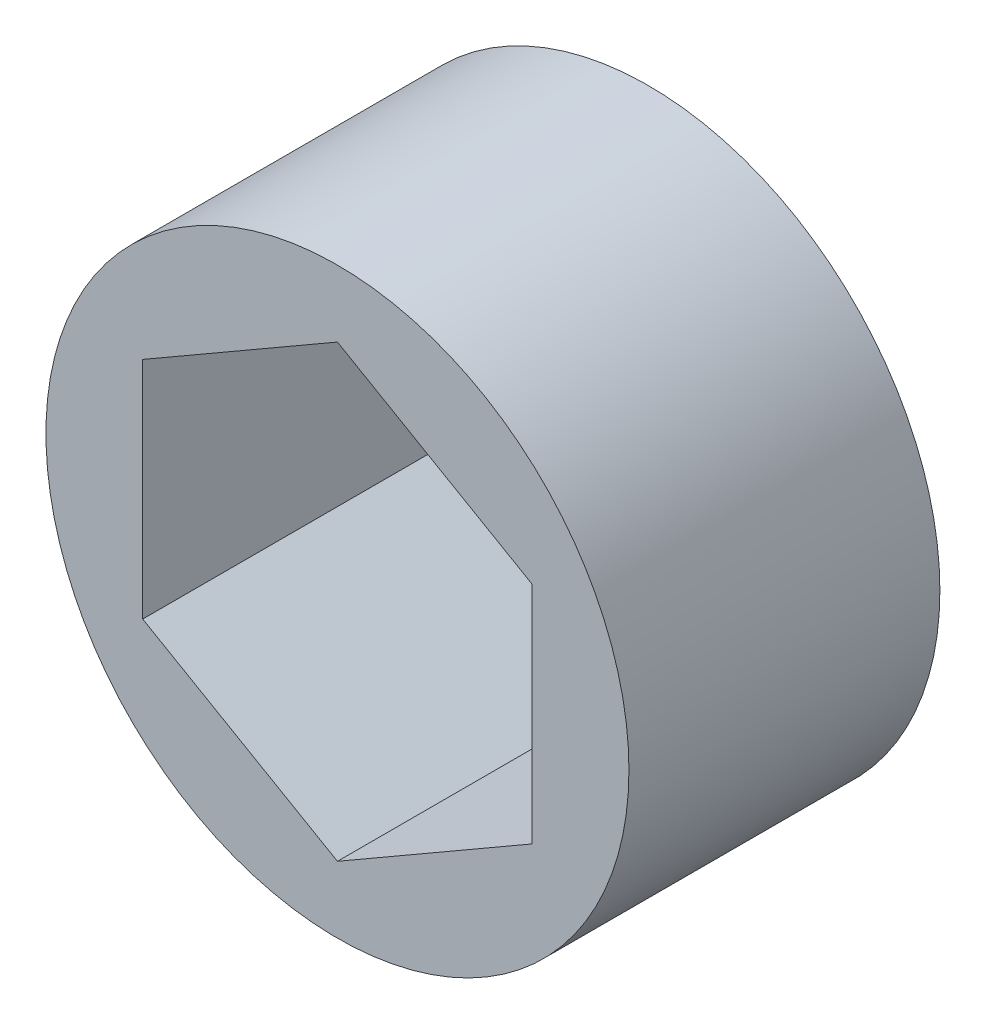
ISO-10303-21;
HEADER;
FILE_DESCRIPTION(('STEP AP214'),'2;1');
FILE_NAME('part.step','',(''),(''),'','','');
FILE_SCHEMA(('AUTOMOTIVE_DESIGN { 1 0 10303 214 1 1 1 1 }'));
ENDSEC;
DATA;
#1=APPLICATION_CONTEXT('core data for automotive mechanical design processes');
#2=APPLICATION_PROTOCOL_DEFINITION('international standard','automotive_design',2000,#1);
#3=PRODUCT_CONTEXT('',#1,'mechanical');
#4=PRODUCT('Part','Part','',(#3));
#5=PRODUCT_RELATED_PRODUCT_CATEGORY('part','',(#4));
#6=PRODUCT_DEFINITION_FORMATION('','',#4);
#7=PRODUCT_DEFINITION_CONTEXT('part definition',#1,'design');
#8=PRODUCT_DEFINITION('design','',#6,#7);
#9=PRODUCT_DEFINITION_SHAPE('','',#8);
#10=(LENGTH_UNIT() NAMED_UNIT(*) SI_UNIT(.MILLI.,.METRE.));
#11=(NAMED_UNIT(*) PLANE_ANGLE_UNIT() SI_UNIT($,.RADIAN.));
#12=(NAMED_UNIT(*) SI_UNIT($,.STERADIAN.) SOLID_ANGLE_UNIT());
#13=UNCERTAINTY_MEASURE_WITH_UNIT(LENGTH_MEASURE(1.E-05),#10,'distance_accuracy_value','');
#14=(GEOMETRIC_REPRESENTATION_CONTEXT(3) GLOBAL_UNCERTAINTY_ASSIGNED_CONTEXT((#13)) GLOBAL_UNIT_ASSIGNED_CONTEXT((#10,
#11,#12)) REPRESENTATION_CONTEXT('',''));
#15=CARTESIAN_POINT('',(0.,0.,0.));
#16=DIRECTION('',(0.,0.,1.));
#17=DIRECTION('',(1.,0.,0.));
#18=AXIS2_PLACEMENT_3D('',#15,#16,#17);
#19=CARTESIAN_POINT('',(0.,0.,5.08));
#20=DIRECTION('',(0.,0.,1.));
#21=DIRECTION('',(1.,0.,0.));
#22=AXIS2_PLACEMENT_3D('',#19,#20,#21);
#23=PLANE('',#22);
#24=CARTESIAN_POINT('',(0.,0.,5.08));
#25=DIRECTION('',(0.,0.,1.));
#26=DIRECTION('',(1.,0.,0.));
#27=AXIS2_PLACEMENT_3D('',#24,#25,#26);
#28=CIRCLE('',#27,9.525);
#29=CARTESIAN_POINT('',(9.525,0.,5.08));
#30=VERTEX_POINT('',#29);
#31=EDGE_CURVE('E11',#30,#30,#28,.T.);
#32=ORIENTED_EDGE('',*,*,#31,.T.);
#33=EDGE_LOOP('',(#32));
#34=FACE_BOUND('',#33,.T.);
#35=DIRECTION('',(-0.866025403784439,0.5,0.));
#36=VECTOR('',#35,1.);
#37=CARTESIAN_POINT('',(6.3627,3.67350655777283,5.08));
#38=LINE('',#37,#36);
#39=CARTESIAN_POINT('',(6.3627,3.67350655777283,5.08));
#40=VERTEX_POINT('',#39);
#41=CARTESIAN_POINT('',(0.,7.34701311554566,5.08));
#42=VERTEX_POINT('',#41);
#43=EDGE_CURVE('E104',#40,#42,#38,.T.);
#44=ORIENTED_EDGE('',*,*,#43,.F.);
#45=DIRECTION('',(0.,1.,0.));
#46=VECTOR('',#45,1.);
#47=CARTESIAN_POINT('',(6.3627,-3.67350655777283,5.08));
#48=LINE('',#47,#46);
#49=CARTESIAN_POINT('',(6.3627,-3.67350655777283,5.08));
#50=VERTEX_POINT('',#49);
#51=EDGE_CURVE('E96',#50,#40,#48,.T.);
#52=ORIENTED_EDGE('',*,*,#51,.F.);
#53=DIRECTION('',(0.866025403784438,0.5,0.));
#54=VECTOR('',#53,1.);
#55=CARTESIAN_POINT('',(0.,-7.34701311554566,5.08));
#56=LINE('',#55,#54);
#57=CARTESIAN_POINT('',(0.,-7.34701311554566,5.08));
#58=VERTEX_POINT('',#57);
#59=EDGE_CURVE('E124',#58,#50,#56,.T.);
#60=ORIENTED_EDGE('',*,*,#59,.F.);
#61=DIRECTION('',(0.866025403784439,-0.5,0.));
#62=VECTOR('',#61,1.);
#63=CARTESIAN_POINT('',(-6.3627,-3.67350655777284,5.08));
#64=LINE('',#63,#62);
#65=CARTESIAN_POINT('',(-6.3627,-3.67350655777284,5.08));
#66=VERTEX_POINT('',#65);
#67=EDGE_CURVE('E122',#66,#58,#64,.T.);
#68=ORIENTED_EDGE('',*,*,#67,.F.);
#69=DIRECTION('',(0.,-1.,0.));
#70=VECTOR('',#69,1.);
#71=CARTESIAN_POINT('',(-6.3627,3.67350655777283,5.08));
#72=LINE('',#71,#70);
#73=CARTESIAN_POINT('',(-6.3627,3.67350655777283,5.08));
#74=VERTEX_POINT('',#73);
#75=EDGE_CURVE('E118',#74,#66,#72,.T.);
#76=ORIENTED_EDGE('',*,*,#75,.F.);
#77=DIRECTION('',(-0.866025403784438,-0.5,0.));
#78=VECTOR('',#77,1.);
#79=CARTESIAN_POINT('',(0.,7.34701311554566,5.08));
#80=LINE('',#79,#78);
#81=EDGE_CURVE('E116',#42,#74,#80,.T.);
#82=ORIENTED_EDGE('',*,*,#81,.F.);
#83=EDGE_LOOP('',(#44,#52,#60,#68,#76,#82));
#84=FACE_BOUND('',#83,.T.);
#85=ADVANCED_FACE('F43',(#34,#84),#23,.T.);
#86=CARTESIAN_POINT('',(0.,0.,-5.08));
#87=DIRECTION('',(0.,0.,1.));
#88=DIRECTION('',(1.,0.,0.));
#89=AXIS2_PLACEMENT_3D('',#86,#87,#88);
#90=PLANE('',#89);
#91=CARTESIAN_POINT('',(0.,0.,-5.08));
#92=DIRECTION('',(0.,0.,1.));
#93=DIRECTION('',(1.,0.,0.));
#94=AXIS2_PLACEMENT_3D('',#91,#92,#93);
#95=CIRCLE('',#94,9.525);
#96=CARTESIAN_POINT('',(9.525,0.,-5.08));
#97=VERTEX_POINT('',#96);
#98=EDGE_CURVE('E47',#97,#97,#95,.T.);
#99=ORIENTED_EDGE('',*,*,#98,.F.);
#100=EDGE_LOOP('',(#99));
#101=FACE_BOUND('',#100,.T.);
#102=DIRECTION('',(0.,1.,0.));
#103=VECTOR('',#102,1.);
#104=CARTESIAN_POINT('',(6.3627,-3.67350655777283,-5.08));
#105=LINE('',#104,#103);
#106=CARTESIAN_POINT('',(6.3627,-3.67350655777283,-5.08));
#107=VERTEX_POINT('',#106);
#108=CARTESIAN_POINT('',(6.3627,3.67350655777283,-5.08));
#109=VERTEX_POINT('',#108);
#110=EDGE_CURVE('E66',#107,#109,#105,.T.);
#111=ORIENTED_EDGE('',*,*,#110,.T.);
#112=DIRECTION('',(-0.866025403784439,0.5,0.));
#113=VECTOR('',#112,1.);
#114=CARTESIAN_POINT('',(6.3627,3.67350655777283,-5.08));
#115=LINE('',#114,#113);
#116=CARTESIAN_POINT('',(0.,7.34701311554566,-5.08));
#117=VERTEX_POINT('',#116);
#118=EDGE_CURVE('E111',#109,#117,#115,.T.);
#119=ORIENTED_EDGE('',*,*,#118,.T.);
#120=DIRECTION('',(-0.866025403784438,-0.5,0.));
#121=VECTOR('',#120,1.);
#122=CARTESIAN_POINT('',(0.,7.34701311554566,-5.08));
#123=LINE('',#122,#121);
#124=CARTESIAN_POINT('',(-6.3627,3.67350655777283,-5.08));
#125=VERTEX_POINT('',#124);
#126=EDGE_CURVE('E128',#117,#125,#123,.T.);
#127=ORIENTED_EDGE('',*,*,#126,.T.);
#128=DIRECTION('',(0.,-1.,0.));
#129=VECTOR('',#128,1.);
#130=CARTESIAN_POINT('',(-6.3627,3.67350655777283,-5.08));
#131=LINE('',#130,#129);
#132=CARTESIAN_POINT('',(-6.3627,-3.67350655777284,-5.08));
#133=VERTEX_POINT('',#132);
#134=EDGE_CURVE('E131',#125,#133,#131,.T.);
#135=ORIENTED_EDGE('',*,*,#134,.T.);
#136=DIRECTION('',(0.866025403784439,-0.5,0.));
#137=VECTOR('',#136,1.);
#138=CARTESIAN_POINT('',(-6.3627,-3.67350655777284,-5.08));
#139=LINE('',#138,#137);
#140=CARTESIAN_POINT('',(0.,-7.34701311554566,-5.08));
#141=VERTEX_POINT('',#140);
#142=EDGE_CURVE('E134',#133,#141,#139,.T.);
#143=ORIENTED_EDGE('',*,*,#142,.T.);
#144=DIRECTION('',(0.866025403784438,0.5,0.));
#145=VECTOR('',#144,1.);
#146=CARTESIAN_POINT('',(0.,-7.34701311554566,-5.08));
#147=LINE('',#146,#145);
#148=EDGE_CURVE('E105',#141,#107,#147,.T.);
#149=ORIENTED_EDGE('',*,*,#148,.T.);
#150=EDGE_LOOP('',(#111,#119,#127,#135,#143,#149));
#151=FACE_BOUND('',#150,.T.);
#152=ADVANCED_FACE('F151',(#101,#151),#90,.F.);
#153=CARTESIAN_POINT('',(0.,0.,5.08));
#154=DIRECTION('',(0.,0.,-1.));
#155=DIRECTION('',(-1.,0.,0.));
#156=AXIS2_PLACEMENT_3D('',#153,#154,#155);
#157=CYLINDRICAL_SURFACE('',#156,9.525);
#158=ORIENTED_EDGE('',*,*,#31,.F.);
#159=EDGE_LOOP('',(#158));
#160=FACE_BOUND('',#159,.T.);
#161=ORIENTED_EDGE('',*,*,#98,.T.);
#162=EDGE_LOOP('',(#161));
#163=FACE_BOUND('',#162,.T.);
#164=ADVANCED_FACE('F45',(#160,#163),#157,.T.);
#165=CARTESIAN_POINT('',(6.3627,-3.67350655777283,5.08));
#166=DIRECTION('',(-1.,0.,0.));
#167=DIRECTION('',(0.,-1.,0.));
#168=AXIS2_PLACEMENT_3D('',#165,#166,#167);
#169=PLANE('',#168);
#170=ORIENTED_EDGE('',*,*,#110,.F.);
#171=DIRECTION('',(0.,0.,-1.));
#172=VECTOR('',#171,1.);
#173=CARTESIAN_POINT('',(6.3627,-3.67350655777283,5.08));
#174=LINE('',#173,#172);
#175=EDGE_CURVE('E100',#50,#107,#174,.T.);
#176=ORIENTED_EDGE('',*,*,#175,.F.);
#177=ORIENTED_EDGE('',*,*,#51,.T.);
#178=DIRECTION('',(0.,0.,-1.));
#179=VECTOR('',#178,1.);
#180=CARTESIAN_POINT('',(6.3627,3.67350655777283,5.08));
#181=LINE('',#180,#179);
#182=EDGE_CURVE('E99',#40,#109,#181,.T.);
#183=ORIENTED_EDGE('',*,*,#182,.T.);
#184=EDGE_LOOP('',(#170,#176,#177,#183));
#185=FACE_BOUND('',#184,.T.);
#186=ADVANCED_FACE('F98',(#185),#169,.T.);
#187=CARTESIAN_POINT('',(6.3627,3.67350655777283,5.08));
#188=DIRECTION('',(-0.5,-0.866025403784439,0.));
#189=DIRECTION('',(0.866025403784439,-0.5,0.));
#190=AXIS2_PLACEMENT_3D('',#187,#188,#189);
#191=PLANE('',#190);
#192=ORIENTED_EDGE('',*,*,#118,.F.);
#193=ORIENTED_EDGE('',*,*,#182,.F.);
#194=ORIENTED_EDGE('',*,*,#43,.T.);
#195=DIRECTION('',(0.,0.,-1.));
#196=VECTOR('',#195,1.);
#197=CARTESIAN_POINT('',(0.,7.34701311554566,5.08));
#198=LINE('',#197,#196);
#199=EDGE_CURVE('E112',#42,#117,#198,.T.);
#200=ORIENTED_EDGE('',*,*,#199,.T.);
#201=EDGE_LOOP('',(#192,#193,#194,#200));
#202=FACE_BOUND('',#201,.T.);
#203=ADVANCED_FACE('F108',(#202),#191,.T.);
#204=CARTESIAN_POINT('',(0.,7.34701311554566,5.08));
#205=DIRECTION('',(0.5,-0.866025403784438,0.));
#206=DIRECTION('',(0.866025403784438,0.500000000000001,0.));
#207=AXIS2_PLACEMENT_3D('',#204,#205,#206);
#208=PLANE('',#207);
#209=ORIENTED_EDGE('',*,*,#126,.F.);
#210=ORIENTED_EDGE('',*,*,#199,.F.);
#211=ORIENTED_EDGE('',*,*,#81,.T.);
#212=DIRECTION('',(0.,0.,-1.));
#213=VECTOR('',#212,1.);
#214=CARTESIAN_POINT('',(-6.3627,3.67350655777283,5.08));
#215=LINE('',#214,#213);
#216=EDGE_CURVE('E143',#74,#125,#215,.T.);
#217=ORIENTED_EDGE('',*,*,#216,.T.);
#218=EDGE_LOOP('',(#209,#210,#211,#217));
#219=FACE_BOUND('',#218,.T.);
#220=ADVANCED_FACE('F147',(#219),#208,.T.);
#221=CARTESIAN_POINT('',(-6.3627,3.67350655777283,5.08));
#222=DIRECTION('',(1.,0.,0.));
#223=DIRECTION('',(0.,1.,0.));
#224=AXIS2_PLACEMENT_3D('',#221,#222,#223);
#225=PLANE('',#224);
#226=ORIENTED_EDGE('',*,*,#134,.F.);
#227=ORIENTED_EDGE('',*,*,#216,.F.);
#228=ORIENTED_EDGE('',*,*,#75,.T.);
#229=DIRECTION('',(0.,0.,-1.));
#230=VECTOR('',#229,1.);
#231=CARTESIAN_POINT('',(-6.3627,-3.67350655777284,5.08));
#232=LINE('',#231,#230);
#233=EDGE_CURVE('E141',#66,#133,#232,.T.);
#234=ORIENTED_EDGE('',*,*,#233,.T.);
#235=EDGE_LOOP('',(#226,#227,#228,#234));
#236=FACE_BOUND('',#235,.T.);
#237=ADVANCED_FACE('F159',(#236),#225,.T.);
#238=CARTESIAN_POINT('',(-6.3627,-3.67350655777284,5.08));
#239=DIRECTION('',(0.5,0.866025403784439,0.));
#240=DIRECTION('',(-0.866025403784439,0.5,0.));
#241=AXIS2_PLACEMENT_3D('',#238,#239,#240);
#242=PLANE('',#241);
#243=ORIENTED_EDGE('',*,*,#142,.F.);
#244=ORIENTED_EDGE('',*,*,#233,.F.);
#245=ORIENTED_EDGE('',*,*,#67,.T.);
#246=DIRECTION('',(0.,0.,-1.));
#247=VECTOR('',#246,1.);
#248=CARTESIAN_POINT('',(0.,-7.34701311554566,5.08));
#249=LINE('',#248,#247);
#250=EDGE_CURVE('E58',#58,#141,#249,.T.);
#251=ORIENTED_EDGE('',*,*,#250,.T.);
#252=EDGE_LOOP('',(#243,#244,#245,#251));
#253=FACE_BOUND('',#252,.T.);
#254=ADVANCED_FACE('F157',(#253),#242,.T.);
#255=CARTESIAN_POINT('',(0.,-7.34701311554566,5.08));
#256=DIRECTION('',(-0.5,0.866025403784438,0.));
#257=DIRECTION('',(-0.866025403784438,-0.500000000000001,0.));
#258=AXIS2_PLACEMENT_3D('',#255,#256,#257);
#259=PLANE('',#258);
#260=ORIENTED_EDGE('',*,*,#148,.F.);
#261=ORIENTED_EDGE('',*,*,#250,.F.);
#262=ORIENTED_EDGE('',*,*,#59,.T.);
#263=ORIENTED_EDGE('',*,*,#175,.T.);
#264=EDGE_LOOP('',(#260,#261,#262,#263));
#265=FACE_BOUND('',#264,.T.);
#266=ADVANCED_FACE('F153',(#265),#259,.T.);
#267=CLOSED_SHELL('',(#85,#152,#164,#186,#203,#220,#237,#254,#266));
#268=MANIFOLD_SOLID_BREP('B2',#267);
#269=ADVANCED_BREP_SHAPE_REPRESENTATION('',(#18,#268),#14);
#270=SHAPE_DEFINITION_REPRESENTATION(#9,#269);
ENDSEC;
END-ISO-10303-21;
